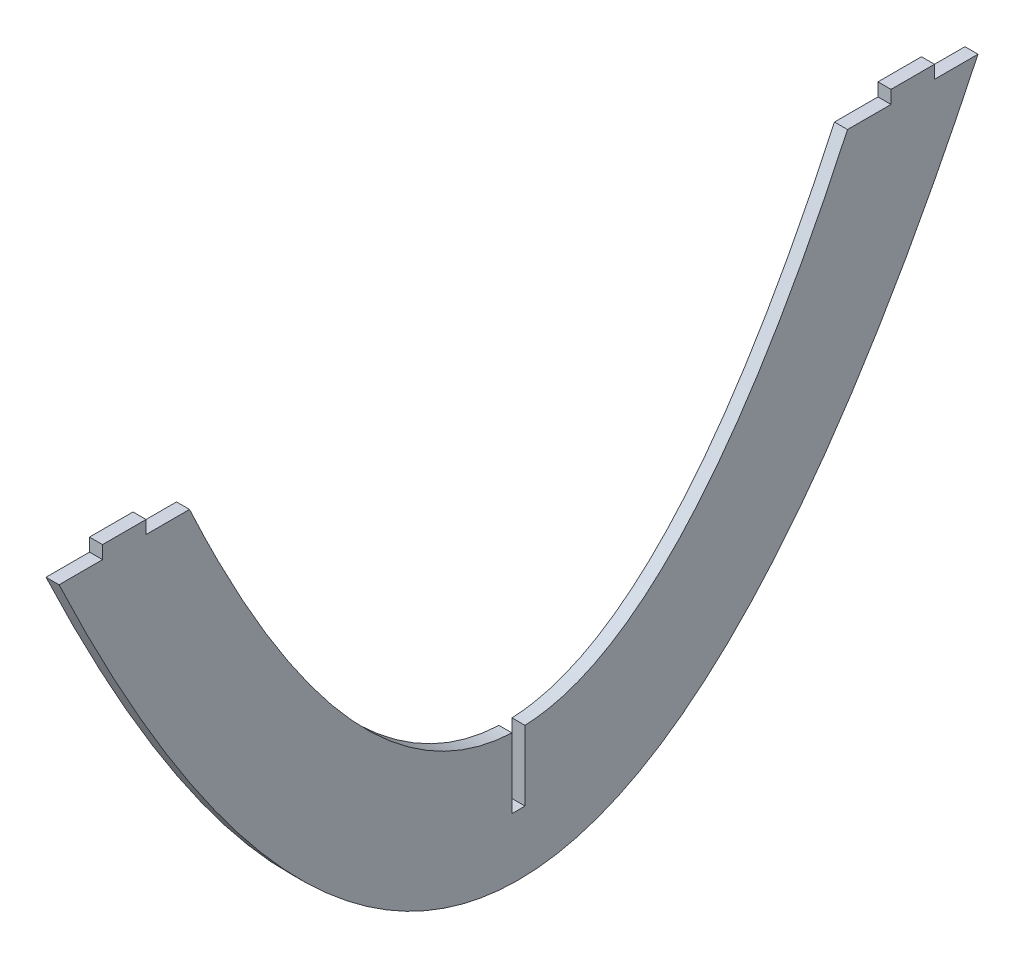
ISO-10303-21;
HEADER;
FILE_DESCRIPTION(('STEP AP214'),'2;1');
FILE_NAME('part.step','',(''),(''),'','','');
FILE_SCHEMA(('AUTOMOTIVE_DESIGN { 1 0 10303 214 1 1 1 1 }'));
ENDSEC;
DATA;
#1=APPLICATION_CONTEXT('core data for automotive mechanical design processes');
#2=APPLICATION_PROTOCOL_DEFINITION('international standard','automotive_design',2000,#1);
#3=PRODUCT_CONTEXT('',#1,'mechanical');
#4=PRODUCT('Part','Part','',(#3));
#5=PRODUCT_RELATED_PRODUCT_CATEGORY('part','',(#4));
#6=PRODUCT_DEFINITION_FORMATION('','',#4);
#7=PRODUCT_DEFINITION_CONTEXT('part definition',#1,'design');
#8=PRODUCT_DEFINITION('design','',#6,#7);
#9=PRODUCT_DEFINITION_SHAPE('','',#8);
#10=(LENGTH_UNIT() NAMED_UNIT(*) SI_UNIT(.MILLI.,.METRE.));
#11=(NAMED_UNIT(*) PLANE_ANGLE_UNIT() SI_UNIT($,.RADIAN.));
#12=(NAMED_UNIT(*) SI_UNIT($,.STERADIAN.) SOLID_ANGLE_UNIT());
#13=UNCERTAINTY_MEASURE_WITH_UNIT(LENGTH_MEASURE(1.E-05),#10,'distance_accuracy_value','');
#14=(GEOMETRIC_REPRESENTATION_CONTEXT(3) GLOBAL_UNCERTAINTY_ASSIGNED_CONTEXT((#13)) GLOBAL_UNIT_ASSIGNED_CONTEXT((#10,
#11,#12)) REPRESENTATION_CONTEXT('',''));
#15=CARTESIAN_POINT('',(0.,0.,0.));
#16=DIRECTION('',(0.,0.,1.));
#17=DIRECTION('',(1.,0.,0.));
#18=AXIS2_PLACEMENT_3D('',#15,#16,#17);
#19=CARTESIAN_POINT('',(3.,150.000927140069,-75.6420306410764));
#20=CARTESIAN_POINT('',(3.,-13.2020271401348,3.1186858651111E-11));
#21=CARTESIAN_POINT('',(3.,150.000927140201,75.6420306411388));
#22=B_SPLINE_CURVE_WITH_KNOTS('',2,(#19,#20,#21),.UNSPECIFIED.,.F.,.F.,(3,3),(0.178478000772876,
0.821521999226859),.UNSPECIFIED.);
#23=DIRECTION('',(-1.,0.,0.));
#24=VECTOR('',#23,1.);
#25=SURFACE_OF_LINEAR_EXTRUSION('',#22,#24);
#26=DIRECTION('',(-1.,0.,0.));
#27=VECTOR('',#26,1.);
#28=CARTESIAN_POINT('',(3.,68.4315388519997,-1.49999999999345));
#29=LINE('',#28,#27);
#30=CARTESIAN_POINT('',(3.,68.4315388519997,-1.49999999999345));
#31=VERTEX_POINT('',#30);
#32=CARTESIAN_POINT('',(0.,68.4315388519997,-1.49999999999345));
#33=VERTEX_POINT('',#32);
#34=EDGE_CURVE('E182',#31,#33,#29,.T.);
#35=ORIENTED_EDGE('',*,*,#34,.F.);
#36=CARTESIAN_POINT('',(3.,150.000927140001,-75.642030641045));
#37=VERTEX_POINT('',#36);
#38=EDGE_CURVE('E237',#37,#31,#22,.T.);
#39=ORIENTED_EDGE('',*,*,#38,.F.);
#40=DIRECTION('',(-1.,0.,0.));
#41=VECTOR('',#40,1.);
#42=CARTESIAN_POINT('',(3.,150.000927140001,-75.642030641045));
#43=LINE('',#42,#41);
#44=CARTESIAN_POINT('',(0.,150.000927140001,-75.642030641045));
#45=VERTEX_POINT('',#44);
#46=EDGE_CURVE('E298',#37,#45,#43,.T.);
#47=ORIENTED_EDGE('',*,*,#46,.T.);
#48=CARTESIAN_POINT('',(0.,150.000927140069,-75.6420306410764));
#49=CARTESIAN_POINT('',(0.,-13.2020271401348,3.1186858651111E-11));
#50=CARTESIAN_POINT('',(0.,150.000927140201,75.6420306411388));
#51=B_SPLINE_CURVE_WITH_KNOTS('',2,(#48,#49,#50),.UNSPECIFIED.,.F.,.F.,(3,3),(0.178478000772876,
0.821521999226859),.UNSPECIFIED.);
#52=EDGE_CURVE('E291',#45,#33,#51,.T.);
#53=ORIENTED_EDGE('',*,*,#52,.T.);
#54=EDGE_LOOP('',(#35,#39,#47,#53));
#55=FACE_BOUND('',#54,.T.);
#56=ADVANCED_FACE('F37',(#55),#25,.F.);
#57=CARTESIAN_POINT('',(3.,68.39945,3.11729808633032E-11));
#58=DIRECTION('',(-1.,0.,0.));
#59=DIRECTION('',(0.,0.,1.));
#60=AXIS2_PLACEMENT_3D('',#57,#58,#59);
#61=PLANE('',#60);
#62=DIRECTION('',(0.,1.,0.));
#63=VECTOR('',#62,1.);
#64=CARTESIAN_POINT('',(3.,0.,-1.49999999999345));
#65=LINE('',#64,#63);
#66=CARTESIAN_POINT('',(3.,52.3672629039927,-1.49999999999345));
#67=VERTEX_POINT('',#66);
#68=EDGE_CURVE('E159',#67,#31,#65,.T.);
#69=ORIENTED_EDGE('',*,*,#68,.F.);
#70=DIRECTION('',(0.,0.,1.));
#71=VECTOR('',#70,1.);
#72=CARTESIAN_POINT('',(3.,52.3672629039927,0.));
#73=LINE('',#72,#71);
#74=CARTESIAN_POINT('',(3.,52.3672629039927,1.50000000000655));
#75=VERTEX_POINT('',#74);
#76=EDGE_CURVE('E154',#67,#75,#73,.T.);
#77=ORIENTED_EDGE('',*,*,#76,.T.);
#78=DIRECTION('',(0.,1.,0.));
#79=VECTOR('',#78,1.);
#80=CARTESIAN_POINT('',(3.,0.,1.50000000000655));
#81=LINE('',#80,#79);
#82=CARTESIAN_POINT('',(3.,68.4315388520002,1.50000000000655));
#83=VERTEX_POINT('',#82);
#84=EDGE_CURVE('E162',#75,#83,#81,.T.);
#85=ORIENTED_EDGE('',*,*,#84,.T.);
#86=CARTESIAN_POINT('',(3.,150.000927140001,75.642030641046));
#87=VERTEX_POINT('',#86);
#88=EDGE_CURVE('E242',#83,#87,#22,.T.);
#89=ORIENTED_EDGE('',*,*,#88,.T.);
#90=DIRECTION('',(0.,0.,1.));
#91=VECTOR('',#90,1.);
#92=CARTESIAN_POINT('',(3.,150.000927140001,105.641600300252));
#93=LINE('',#92,#91);
#94=CARTESIAN_POINT('',(3.,150.000927140001,85.6418154706493));
#95=VERTEX_POINT('',#94);
#96=EDGE_CURVE('E243',#87,#95,#93,.T.);
#97=ORIENTED_EDGE('',*,*,#96,.T.);
#98=DIRECTION('',(0.,-1.,0.));
#99=VECTOR('',#98,1.);
#100=CARTESIAN_POINT('',(3.,153.000927140001,85.6418154706493));
#101=LINE('',#100,#99);
#102=CARTESIAN_POINT('',(3.,153.000927140001,85.6418154706493));
#103=VERTEX_POINT('',#102);
#104=EDGE_CURVE('E204',#103,#95,#101,.T.);
#105=ORIENTED_EDGE('',*,*,#104,.F.);
#106=DIRECTION('',(0.,0.,-1.));
#107=VECTOR('',#106,1.);
#108=CARTESIAN_POINT('',(3.,153.000927140001,1.29323288714268E-13));
#109=LINE('',#108,#107);
#110=CARTESIAN_POINT('',(3.,153.000927140001,95.6418154706493));
#111=VERTEX_POINT('',#110);
#112=EDGE_CURVE('E188',#111,#103,#109,.T.);
#113=ORIENTED_EDGE('',*,*,#112,.F.);
#114=DIRECTION('',(0.,-1.,0.));
#115=VECTOR('',#114,1.);
#116=CARTESIAN_POINT('',(3.,153.000927140001,95.6418154706493));
#117=LINE('',#116,#115);
#118=CARTESIAN_POINT('',(3.,150.000927140001,95.6418154706493));
#119=VERTEX_POINT('',#118);
#120=EDGE_CURVE('E207',#111,#119,#117,.T.);
#121=ORIENTED_EDGE('',*,*,#120,.T.);
#122=CARTESIAN_POINT('',(3.,150.000927140001,105.641600300252));
#123=VERTEX_POINT('',#122);
#124=EDGE_CURVE('E61',#119,#123,#93,.T.);
#125=ORIENTED_EDGE('',*,*,#124,.T.);
#126=CARTESIAN_POINT('',(3.,150.000927140077,105.641600300288));
#127=CARTESIAN_POINT('',(3.,-73.2020271400111,3.09596098757581E-11));
#128=CARTESIAN_POINT('',(3.,150.000927139945,-105.641600300227));
#129=B_SPLINE_CURVE_WITH_KNOTS('',2,(#126,#127,#128),.UNSPECIFIED.,.F.,.F.,(3,3),
(0.0552466734511027,0.944753326548637),.UNSPECIFIED.);
#130=CARTESIAN_POINT('',(3.,150.000927139945,-105.641600300227));
#131=VERTEX_POINT('',#130);
#132=EDGE_CURVE('E249',#123,#131,#129,.T.);
#133=ORIENTED_EDGE('',*,*,#132,.T.);
#134=DIRECTION('',(0.,0.,1.));
#135=VECTOR('',#134,1.);
#136=CARTESIAN_POINT('',(3.,150.000927140001,-75.642030641045));
#137=LINE('',#136,#135);
#138=CARTESIAN_POINT('',(3.,150.000927140001,-95.6418154706358));
#139=VERTEX_POINT('',#138);
#140=EDGE_CURVE('E255',#131,#139,#137,.T.);
#141=ORIENTED_EDGE('',*,*,#140,.T.);
#142=DIRECTION('',(0.,-1.,0.));
#143=VECTOR('',#142,1.);
#144=CARTESIAN_POINT('',(3.,153.000927140001,-95.6418154706358));
#145=LINE('',#144,#143);
#146=CARTESIAN_POINT('',(3.,153.000927140001,-95.6418154706358));
#147=VERTEX_POINT('',#146);
#148=EDGE_CURVE('E228',#147,#139,#145,.T.);
#149=ORIENTED_EDGE('',*,*,#148,.F.);
#150=DIRECTION('',(0.,0.,-1.));
#151=VECTOR('',#150,1.);
#152=CARTESIAN_POINT('',(3.,153.000927140001,1.29323288714268E-13));
#153=LINE('',#152,#151);
#154=CARTESIAN_POINT('',(3.,153.000927140001,-85.6418154706358));
#155=VERTEX_POINT('',#154);
#156=EDGE_CURVE('E217',#155,#147,#153,.T.);
#157=ORIENTED_EDGE('',*,*,#156,.F.);
#158=DIRECTION('',(0.,-1.,0.));
#159=VECTOR('',#158,1.);
#160=CARTESIAN_POINT('',(3.,153.000927140001,-85.6418154706358));
#161=LINE('',#160,#159);
#162=CARTESIAN_POINT('',(3.,150.000927140001,-85.6418154706358));
#163=VERTEX_POINT('',#162);
#164=EDGE_CURVE('E231',#155,#163,#161,.T.);
#165=ORIENTED_EDGE('',*,*,#164,.T.);
#166=EDGE_CURVE('E254',#163,#37,#137,.T.);
#167=ORIENTED_EDGE('',*,*,#166,.T.);
#168=ORIENTED_EDGE('',*,*,#38,.T.);
#169=EDGE_LOOP('',(#69,#77,#85,#89,#97,#105,#113,#121,#125,#133,#141,#149,#157,#165,#167,#168));
#170=FACE_BOUND('',#169,.T.);
#171=ADVANCED_FACE('F168',(#170),#61,.F.);
#172=CARTESIAN_POINT('',(0.,68.39945,3.11729808633032E-11));
#173=DIRECTION('',(-1.,0.,0.));
#174=DIRECTION('',(0.,0.,1.));
#175=AXIS2_PLACEMENT_3D('',#172,#173,#174);
#176=PLANE('',#175);
#177=DIRECTION('',(0.,0.,1.));
#178=VECTOR('',#177,1.);
#179=CARTESIAN_POINT('',(0.,52.3672629039927,0.));
#180=LINE('',#179,#178);
#181=CARTESIAN_POINT('',(0.,52.3672629039927,-1.49999999999345));
#182=VERTEX_POINT('',#181);
#183=CARTESIAN_POINT('',(0.,52.3672629039927,1.50000000000655));
#184=VERTEX_POINT('',#183);
#185=EDGE_CURVE('E53',#182,#184,#180,.T.);
#186=ORIENTED_EDGE('',*,*,#185,.F.);
#187=DIRECTION('',(0.,1.,0.));
#188=VECTOR('',#187,1.);
#189=CARTESIAN_POINT('',(0.,0.,-1.49999999999345));
#190=LINE('',#189,#188);
#191=EDGE_CURVE('E170',#182,#33,#190,.T.);
#192=ORIENTED_EDGE('',*,*,#191,.T.);
#193=ORIENTED_EDGE('',*,*,#52,.F.);
#194=DIRECTION('',(0.,0.,1.));
#195=VECTOR('',#194,1.);
#196=CARTESIAN_POINT('',(0.,150.000927140001,-75.642030641045));
#197=LINE('',#196,#195);
#198=CARTESIAN_POINT('',(0.,150.000927140001,-85.6418154706358));
#199=VERTEX_POINT('',#198);
#200=EDGE_CURVE('E299',#199,#45,#197,.T.);
#201=ORIENTED_EDGE('',*,*,#200,.F.);
#202=DIRECTION('',(0.,-1.,0.));
#203=VECTOR('',#202,1.);
#204=CARTESIAN_POINT('',(0.,153.000927140001,-85.6418154706358));
#205=LINE('',#204,#203);
#206=CARTESIAN_POINT('',(0.,153.000927140001,-85.6418154706358));
#207=VERTEX_POINT('',#206);
#208=EDGE_CURVE('E234',#207,#199,#205,.T.);
#209=ORIENTED_EDGE('',*,*,#208,.F.);
#210=DIRECTION('',(0.,0.,-1.));
#211=VECTOR('',#210,1.);
#212=CARTESIAN_POINT('',(0.,153.000927140001,1.29323288714268E-13));
#213=LINE('',#212,#211);
#214=CARTESIAN_POINT('',(0.,153.000927140001,-95.6418154706358));
#215=VERTEX_POINT('',#214);
#216=EDGE_CURVE('E210',#207,#215,#213,.T.);
#217=ORIENTED_EDGE('',*,*,#216,.T.);
#218=DIRECTION('',(0.,-1.,0.));
#219=VECTOR('',#218,1.);
#220=CARTESIAN_POINT('',(0.,153.000927140001,-95.6418154706358));
#221=LINE('',#220,#219);
#222=CARTESIAN_POINT('',(0.,150.000927140001,-95.6418154706358));
#223=VERTEX_POINT('',#222);
#224=EDGE_CURVE('E221',#215,#223,#221,.T.);
#225=ORIENTED_EDGE('',*,*,#224,.T.);
#226=CARTESIAN_POINT('',(0.,150.000927139945,-105.641600300227));
#227=VERTEX_POINT('',#226);
#228=EDGE_CURVE('E306',#227,#223,#197,.T.);
#229=ORIENTED_EDGE('',*,*,#228,.F.);
#230=CARTESIAN_POINT('',(0.,150.000927140077,105.641600300288));
#231=CARTESIAN_POINT('',(0.,-73.2020271400111,3.09596098757581E-11));
#232=CARTESIAN_POINT('',(0.,150.000927139945,-105.641600300227));
#233=B_SPLINE_CURVE_WITH_KNOTS('',2,(#230,#231,#232),.UNSPECIFIED.,.F.,.F.,(3,3),
(0.0552466734511027,0.944753326548637),.UNSPECIFIED.);
#234=CARTESIAN_POINT('',(0.,150.000927140001,105.641600300252));
#235=VERTEX_POINT('',#234);
#236=EDGE_CURVE('E312',#235,#227,#233,.T.);
#237=ORIENTED_EDGE('',*,*,#236,.F.);
#238=DIRECTION('',(0.,0.,1.));
#239=VECTOR('',#238,1.);
#240=CARTESIAN_POINT('',(0.,150.000927140001,105.641600300252));
#241=LINE('',#240,#239);
#242=CARTESIAN_POINT('',(0.,150.000927140001,95.6418154706493));
#243=VERTEX_POINT('',#242);
#244=EDGE_CURVE('E316',#243,#235,#241,.T.);
#245=ORIENTED_EDGE('',*,*,#244,.F.);
#246=DIRECTION('',(0.,-1.,0.));
#247=VECTOR('',#246,1.);
#248=CARTESIAN_POINT('',(0.,153.000927140001,95.6418154706493));
#249=LINE('',#248,#247);
#250=CARTESIAN_POINT('',(0.,153.000927140001,95.6418154706493));
#251=VERTEX_POINT('',#250);
#252=EDGE_CURVE('E195',#251,#243,#249,.T.);
#253=ORIENTED_EDGE('',*,*,#252,.F.);
#254=DIRECTION('',(0.,0.,1.));
#255=VECTOR('',#254,1.);
#256=CARTESIAN_POINT('',(0.,153.000927140001,1.29323288714268E-13));
#257=LINE('',#256,#255);
#258=CARTESIAN_POINT('',(0.,153.000927140001,85.6418154706493));
#259=VERTEX_POINT('',#258);
#260=EDGE_CURVE('E193',#259,#251,#257,.T.);
#261=ORIENTED_EDGE('',*,*,#260,.F.);
#262=DIRECTION('',(0.,-1.,0.));
#263=VECTOR('',#262,1.);
#264=CARTESIAN_POINT('',(0.,153.000927140001,85.6418154706493));
#265=LINE('',#264,#263);
#266=CARTESIAN_POINT('',(0.,150.000927140001,85.6418154706493));
#267=VERTEX_POINT('',#266);
#268=EDGE_CURVE('E201',#259,#267,#265,.T.);
#269=ORIENTED_EDGE('',*,*,#268,.T.);
#270=CARTESIAN_POINT('',(0.,150.000927140001,75.642030641046));
#271=VERTEX_POINT('',#270);
#272=EDGE_CURVE('E317',#271,#267,#241,.T.);
#273=ORIENTED_EDGE('',*,*,#272,.F.);
#274=CARTESIAN_POINT('',(0.,68.4315388520002,1.50000000000655));
#275=VERTEX_POINT('',#274);
#276=EDGE_CURVE('E236',#275,#271,#51,.T.);
#277=ORIENTED_EDGE('',*,*,#276,.F.);
#278=DIRECTION('',(0.,1.,0.));
#279=VECTOR('',#278,1.);
#280=CARTESIAN_POINT('',(0.,0.,1.50000000000655));
#281=LINE('',#280,#279);
#282=EDGE_CURVE('E173',#184,#275,#281,.T.);
#283=ORIENTED_EDGE('',*,*,#282,.F.);
#284=EDGE_LOOP('',(#186,#192,#193,#201,#209,#217,#225,#229,#237,#245,#253,#261,#269,#273,#277,#283));
#285=FACE_BOUND('',#284,.T.);
#286=ADVANCED_FACE('F277',(#285),#176,.T.);
#287=CARTESIAN_POINT('',(3.,150.000927140001,105.641600300252));
#288=DIRECTION('',(0.,-1.,0.));
#289=DIRECTION('',(0.,0.,-1.));
#290=AXIS2_PLACEMENT_3D('',#287,#288,#289);
#291=PLANE('',#290);
#292=DIRECTION('',(-1.,0.,0.));
#293=VECTOR('',#292,1.);
#294=CARTESIAN_POINT('',(0.,150.000927140001,85.6418154706493));
#295=LINE('',#294,#293);
#296=EDGE_CURVE('E189',#95,#267,#295,.T.);
#297=ORIENTED_EDGE('',*,*,#296,.F.);
#298=ORIENTED_EDGE('',*,*,#96,.F.);
#299=DIRECTION('',(-1.,0.,0.));
#300=VECTOR('',#299,1.);
#301=CARTESIAN_POINT('',(3.,150.000927140001,75.642030641046));
#302=LINE('',#301,#300);
#303=EDGE_CURVE('E11',#87,#271,#302,.T.);
#304=ORIENTED_EDGE('',*,*,#303,.T.);
#305=ORIENTED_EDGE('',*,*,#272,.T.);
#306=EDGE_LOOP('',(#297,#298,#304,#305));
#307=FACE_BOUND('',#306,.T.);
#308=ADVANCED_FACE('F269',(#307),#291,.F.);
#309=CARTESIAN_POINT('',(3.,150.000927140001,-75.642030641045));
#310=DIRECTION('',(0.,-1.,0.));
#311=DIRECTION('',(0.,0.,-1.));
#312=AXIS2_PLACEMENT_3D('',#309,#310,#311);
#313=PLANE('',#312);
#314=DIRECTION('',(-1.,0.,0.));
#315=VECTOR('',#314,1.);
#316=CARTESIAN_POINT('',(0.,150.000927140001,-95.6418154706358));
#317=LINE('',#316,#315);
#318=EDGE_CURVE('E214',#139,#223,#317,.T.);
#319=ORIENTED_EDGE('',*,*,#318,.F.);
#320=ORIENTED_EDGE('',*,*,#140,.F.);
#321=DIRECTION('',(-1.,0.,0.));
#322=VECTOR('',#321,1.);
#323=CARTESIAN_POINT('',(3.,150.000927139945,-105.641600300227));
#324=LINE('',#323,#322);
#325=EDGE_CURVE('E300',#131,#227,#324,.T.);
#326=ORIENTED_EDGE('',*,*,#325,.T.);
#327=ORIENTED_EDGE('',*,*,#228,.T.);
#328=EDGE_LOOP('',(#319,#320,#326,#327));
#329=FACE_BOUND('',#328,.T.);
#330=ADVANCED_FACE('F274',(#329),#313,.F.);
#331=ORIENTED_EDGE('',*,*,#88,.F.);
#332=DIRECTION('',(-1.,0.,0.));
#333=VECTOR('',#332,1.);
#334=CARTESIAN_POINT('',(3.,68.4315388520002,1.50000000000655));
#335=LINE('',#334,#333);
#336=EDGE_CURVE('E158',#83,#275,#335,.T.);
#337=ORIENTED_EDGE('',*,*,#336,.T.);
#338=ORIENTED_EDGE('',*,*,#276,.T.);
#339=ORIENTED_EDGE('',*,*,#303,.F.);
#340=EDGE_LOOP('',(#331,#337,#338,#339));
#341=FACE_BOUND('',#340,.T.);
#342=ADVANCED_FACE('F39',(#341),#25,.F.);
#343=ORIENTED_EDGE('',*,*,#124,.F.);
#344=DIRECTION('',(-1.,0.,0.));
#345=VECTOR('',#344,1.);
#346=CARTESIAN_POINT('',(0.,150.000927140001,95.6418154706493));
#347=LINE('',#346,#345);
#348=EDGE_CURVE('E181',#119,#243,#347,.T.);
#349=ORIENTED_EDGE('',*,*,#348,.T.);
#350=ORIENTED_EDGE('',*,*,#244,.T.);
#351=DIRECTION('',(-1.,0.,0.));
#352=VECTOR('',#351,1.);
#353=CARTESIAN_POINT('',(3.,150.000927140001,105.641600300252));
#354=LINE('',#353,#352);
#355=EDGE_CURVE('E46',#123,#235,#354,.T.);
#356=ORIENTED_EDGE('',*,*,#355,.F.);
#357=EDGE_LOOP('',(#343,#349,#350,#356));
#358=FACE_BOUND('',#357,.T.);
#359=ADVANCED_FACE('F265',(#358),#291,.F.);
#360=DIRECTION('',(-1.,0.,0.));
#361=VECTOR('',#360,1.);
#362=SURFACE_OF_LINEAR_EXTRUSION('',#129,#361);
#363=ORIENTED_EDGE('',*,*,#236,.T.);
#364=ORIENTED_EDGE('',*,*,#325,.F.);
#365=ORIENTED_EDGE('',*,*,#132,.F.);
#366=ORIENTED_EDGE('',*,*,#355,.T.);
#367=EDGE_LOOP('',(#363,#364,#365,#366));
#368=FACE_BOUND('',#367,.T.);
#369=ADVANCED_FACE('F261',(#368),#362,.F.);
#370=ORIENTED_EDGE('',*,*,#166,.F.);
#371=DIRECTION('',(-1.,0.,0.));
#372=VECTOR('',#371,1.);
#373=CARTESIAN_POINT('',(3.96172980859162E-13,150.000927140001,-85.6418154706358));
#374=LINE('',#373,#372);
#375=EDGE_CURVE('E209',#163,#199,#374,.T.);
#376=ORIENTED_EDGE('',*,*,#375,.T.);
#377=ORIENTED_EDGE('',*,*,#200,.T.);
#378=ORIENTED_EDGE('',*,*,#46,.F.);
#379=EDGE_LOOP('',(#370,#376,#377,#378));
#380=FACE_BOUND('',#379,.T.);
#381=ADVANCED_FACE('F264',(#380),#313,.F.);
#382=CARTESIAN_POINT('',(3.96172980859162E-13,153.000927140001,-85.6418154706358));
#383=DIRECTION('',(0.,0.,1.));
#384=DIRECTION('',(1.,0.,0.));
#385=AXIS2_PLACEMENT_3D('',#382,#383,#384);
#386=PLANE('',#385);
#387=ORIENTED_EDGE('',*,*,#375,.F.);
#388=ORIENTED_EDGE('',*,*,#164,.F.);
#389=DIRECTION('',(-1.,0.,0.));
#390=VECTOR('',#389,1.);
#391=CARTESIAN_POINT('',(3.96172980859162E-13,153.000927140001,-85.6418154706358));
#392=LINE('',#391,#390);
#393=EDGE_CURVE('E213',#155,#207,#392,.T.);
#394=ORIENTED_EDGE('',*,*,#393,.T.);
#395=ORIENTED_EDGE('',*,*,#208,.T.);
#396=EDGE_LOOP('',(#387,#388,#394,#395));
#397=FACE_BOUND('',#396,.T.);
#398=ADVANCED_FACE('F361',(#397),#386,.T.);
#399=CARTESIAN_POINT('',(0.,153.000927140001,-95.6418154706358));
#400=DIRECTION('',(0.,0.,1.));
#401=DIRECTION('',(0.,-1.,0.));
#402=AXIS2_PLACEMENT_3D('',#399,#400,#401);
#403=PLANE('',#402);
#404=ORIENTED_EDGE('',*,*,#318,.T.);
#405=ORIENTED_EDGE('',*,*,#224,.F.);
#406=DIRECTION('',(-1.,0.,0.));
#407=VECTOR('',#406,1.);
#408=CARTESIAN_POINT('',(0.,153.000927140001,-95.6418154706358));
#409=LINE('',#408,#407);
#410=EDGE_CURVE('E219',#147,#215,#409,.T.);
#411=ORIENTED_EDGE('',*,*,#410,.F.);
#412=ORIENTED_EDGE('',*,*,#148,.T.);
#413=EDGE_LOOP('',(#404,#405,#411,#412));
#414=FACE_BOUND('',#413,.T.);
#415=ADVANCED_FACE('F354',(#414),#403,.F.);
#416=CARTESIAN_POINT('',(0.,153.000927140001,1.29323288714268E-13));
#417=DIRECTION('',(0.,1.,0.));
#418=DIRECTION('',(0.,0.,1.));
#419=AXIS2_PLACEMENT_3D('',#416,#417,#418);
#420=PLANE('',#419);
#421=ORIENTED_EDGE('',*,*,#216,.F.);
#422=ORIENTED_EDGE('',*,*,#393,.F.);
#423=ORIENTED_EDGE('',*,*,#156,.T.);
#424=ORIENTED_EDGE('',*,*,#410,.T.);
#425=EDGE_LOOP('',(#421,#422,#423,#424));
#426=FACE_BOUND('',#425,.T.);
#427=ADVANCED_FACE('F347',(#426),#420,.T.);
#428=CARTESIAN_POINT('',(0.,153.000927140001,95.6418154706493));
#429=DIRECTION('',(0.,0.,1.));
#430=DIRECTION('',(0.,-1.,0.));
#431=AXIS2_PLACEMENT_3D('',#428,#429,#430);
#432=PLANE('',#431);
#433=ORIENTED_EDGE('',*,*,#348,.F.);
#434=ORIENTED_EDGE('',*,*,#120,.F.);
#435=DIRECTION('',(-1.,0.,0.));
#436=VECTOR('',#435,1.);
#437=CARTESIAN_POINT('',(0.,153.000927140001,95.6418154706493));
#438=LINE('',#437,#436);
#439=EDGE_CURVE('E185',#111,#251,#438,.T.);
#440=ORIENTED_EDGE('',*,*,#439,.T.);
#441=ORIENTED_EDGE('',*,*,#252,.T.);
#442=EDGE_LOOP('',(#433,#434,#440,#441));
#443=FACE_BOUND('',#442,.T.);
#444=ADVANCED_FACE('F345',(#443),#432,.T.);
#445=CARTESIAN_POINT('',(0.,153.000927140001,85.6418154706493));
#446=DIRECTION('',(0.,0.,1.));
#447=DIRECTION('',(0.,-1.,0.));
#448=AXIS2_PLACEMENT_3D('',#445,#446,#447);
#449=PLANE('',#448);
#450=ORIENTED_EDGE('',*,*,#296,.T.);
#451=ORIENTED_EDGE('',*,*,#268,.F.);
#452=DIRECTION('',(-1.,0.,0.));
#453=VECTOR('',#452,1.);
#454=CARTESIAN_POINT('',(0.,153.000927140001,85.6418154706493));
#455=LINE('',#454,#453);
#456=EDGE_CURVE('E191',#103,#259,#455,.T.);
#457=ORIENTED_EDGE('',*,*,#456,.F.);
#458=ORIENTED_EDGE('',*,*,#104,.T.);
#459=EDGE_LOOP('',(#450,#451,#457,#458));
#460=FACE_BOUND('',#459,.T.);
#461=ADVANCED_FACE('F339',(#460),#449,.F.);
#462=CARTESIAN_POINT('',(0.,153.000927140001,1.29323288714268E-13));
#463=DIRECTION('',(0.,1.,0.));
#464=DIRECTION('',(0.,0.,1.));
#465=AXIS2_PLACEMENT_3D('',#462,#463,#464);
#466=PLANE('',#465);
#467=ORIENTED_EDGE('',*,*,#439,.F.);
#468=ORIENTED_EDGE('',*,*,#112,.T.);
#469=ORIENTED_EDGE('',*,*,#456,.T.);
#470=ORIENTED_EDGE('',*,*,#260,.T.);
#471=EDGE_LOOP('',(#467,#468,#469,#470));
#472=FACE_BOUND('',#471,.T.);
#473=ADVANCED_FACE('F342',(#472),#466,.T.);
#474=CARTESIAN_POINT('',(3.,52.3672629039927,0.));
#475=DIRECTION('',(0.,-1.,0.));
#476=DIRECTION('',(0.,0.,-1.));
#477=AXIS2_PLACEMENT_3D('',#474,#475,#476);
#478=PLANE('',#477);
#479=ORIENTED_EDGE('',*,*,#185,.T.);
#480=DIRECTION('',(-1.,0.,0.));
#481=VECTOR('',#480,1.);
#482=CARTESIAN_POINT('',(3.,52.3672629039927,1.50000000000655));
#483=LINE('',#482,#481);
#484=EDGE_CURVE('E150',#75,#184,#483,.T.);
#485=ORIENTED_EDGE('',*,*,#484,.F.);
#486=ORIENTED_EDGE('',*,*,#76,.F.);
#487=DIRECTION('',(-1.,0.,0.));
#488=VECTOR('',#487,1.);
#489=CARTESIAN_POINT('',(3.,52.3672629039927,-1.49999999999345));
#490=LINE('',#489,#488);
#491=EDGE_CURVE('E179',#67,#182,#490,.T.);
#492=ORIENTED_EDGE('',*,*,#491,.T.);
#493=EDGE_LOOP('',(#479,#485,#486,#492));
#494=FACE_BOUND('',#493,.T.);
#495=ADVANCED_FACE('F152',(#494),#478,.F.);
#496=CARTESIAN_POINT('',(3.,0.,-1.49999999999345));
#497=DIRECTION('',(0.,0.,1.));
#498=DIRECTION('',(1.,0.,0.));
#499=AXIS2_PLACEMENT_3D('',#496,#497,#498);
#500=PLANE('',#499);
#501=ORIENTED_EDGE('',*,*,#191,.F.);
#502=ORIENTED_EDGE('',*,*,#491,.F.);
#503=ORIENTED_EDGE('',*,*,#68,.T.);
#504=ORIENTED_EDGE('',*,*,#34,.T.);
#505=EDGE_LOOP('',(#501,#502,#503,#504));
#506=FACE_BOUND('',#505,.T.);
#507=ADVANCED_FACE('F383',(#506),#500,.T.);
#508=CARTESIAN_POINT('',(3.,0.,1.50000000000655));
#509=DIRECTION('',(0.,0.,1.));
#510=DIRECTION('',(1.,0.,0.));
#511=AXIS2_PLACEMENT_3D('',#508,#509,#510);
#512=PLANE('',#511);
#513=ORIENTED_EDGE('',*,*,#282,.T.);
#514=ORIENTED_EDGE('',*,*,#336,.F.);
#515=ORIENTED_EDGE('',*,*,#84,.F.);
#516=ORIENTED_EDGE('',*,*,#484,.T.);
#517=EDGE_LOOP('',(#513,#514,#515,#516));
#518=FACE_BOUND('',#517,.T.);
#519=ADVANCED_FACE('F163',(#518),#512,.F.);
#520=CLOSED_SHELL('',(#56,#171,#286,#308,#330,#342,#359,#369,#381,#398,#415,#427,#444,#461,#473,
#495,#507,#519));
#521=MANIFOLD_SOLID_BREP('B2',#520);
#522=ADVANCED_BREP_SHAPE_REPRESENTATION('',(#18,#521),#14);
#523=SHAPE_DEFINITION_REPRESENTATION(#9,#522);
ENDSEC;
END-ISO-10303-21;
